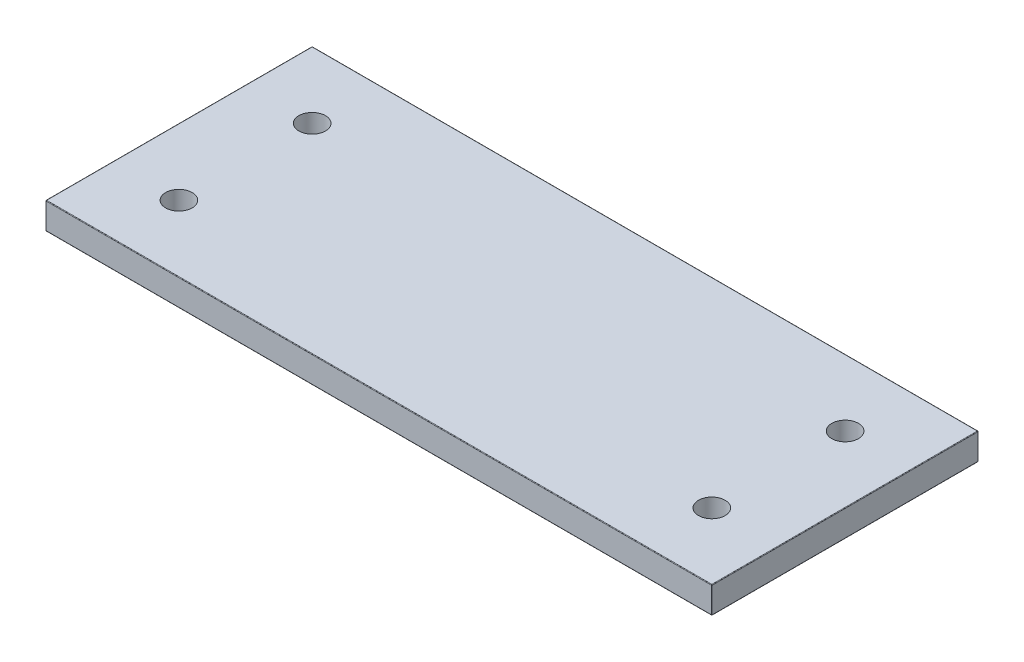
ISO-10303-21;
HEADER;
FILE_DESCRIPTION(('STEP AP214'),'2;1');
FILE_NAME('part.step','',(''),(''),'','','');
FILE_SCHEMA(('AUTOMOTIVE_DESIGN { 1 0 10303 214 1 1 1 1 }'));
ENDSEC;
DATA;
#1=APPLICATION_CONTEXT('core data for automotive mechanical design processes');
#2=APPLICATION_PROTOCOL_DEFINITION('international standard','automotive_design',2000,#1);
#3=PRODUCT_CONTEXT('',#1,'mechanical');
#4=PRODUCT('Part','Part','',(#3));
#5=PRODUCT_RELATED_PRODUCT_CATEGORY('part','',(#4));
#6=PRODUCT_DEFINITION_FORMATION('','',#4);
#7=PRODUCT_DEFINITION_CONTEXT('part definition',#1,'design');
#8=PRODUCT_DEFINITION('design','',#6,#7);
#9=PRODUCT_DEFINITION_SHAPE('','',#8);
#10=(LENGTH_UNIT() NAMED_UNIT(*) SI_UNIT(.MILLI.,.METRE.));
#11=(NAMED_UNIT(*) PLANE_ANGLE_UNIT() SI_UNIT($,.RADIAN.));
#12=(NAMED_UNIT(*) SI_UNIT($,.STERADIAN.) SOLID_ANGLE_UNIT());
#13=UNCERTAINTY_MEASURE_WITH_UNIT(LENGTH_MEASURE(1.E-05),#10,'distance_accuracy_value','');
#14=(GEOMETRIC_REPRESENTATION_CONTEXT(3) GLOBAL_UNCERTAINTY_ASSIGNED_CONTEXT((#13)) GLOBAL_UNIT_ASSIGNED_CONTEXT((#10,
#11,#12)) REPRESENTATION_CONTEXT('',''));
#15=CARTESIAN_POINT('',(0.,0.,0.));
#16=DIRECTION('',(0.,0.,1.));
#17=DIRECTION('',(1.,0.,0.));
#18=AXIS2_PLACEMENT_3D('',#15,#16,#17);
#19=CARTESIAN_POINT('',(0.,10.,0.));
#20=DIRECTION('',(0.,1.,0.));
#21=DIRECTION('',(0.,0.,1.));
#22=AXIS2_PLACEMENT_3D('',#19,#20,#21);
#23=PLANE('',#22);
#24=DIRECTION('',(-1.,0.,0.));
#25=VECTOR('',#24,1.);
#26=CARTESIAN_POINT('',(-125.,10.,-49.8));
#27=LINE('',#26,#25);
#28=CARTESIAN_POINT('',(124.8,10.,-49.8));
#29=VERTEX_POINT('',#28);
#30=CARTESIAN_POINT('',(-124.8,10.,-49.8));
#31=VERTEX_POINT('',#30);
#32=EDGE_CURVE('E201',#29,#31,#27,.T.);
#33=ORIENTED_EDGE('',*,*,#32,.T.);
#34=DIRECTION('',(0.,0.,1.));
#35=VECTOR('',#34,1.);
#36=CARTESIAN_POINT('',(-124.8,10.,50.));
#37=LINE('',#36,#35);
#38=CARTESIAN_POINT('',(-124.8,10.,49.8));
#39=VERTEX_POINT('',#38);
#40=EDGE_CURVE('E203',#31,#39,#37,.T.);
#41=ORIENTED_EDGE('',*,*,#40,.T.);
#42=DIRECTION('',(1.,0.,0.));
#43=VECTOR('',#42,1.);
#44=CARTESIAN_POINT('',(125.,10.,49.8));
#45=LINE('',#44,#43);
#46=CARTESIAN_POINT('',(124.8,10.,49.8));
#47=VERTEX_POINT('',#46);
#48=EDGE_CURVE('E197',#39,#47,#45,.T.);
#49=ORIENTED_EDGE('',*,*,#48,.T.);
#50=DIRECTION('',(0.,0.,-1.));
#51=VECTOR('',#50,1.);
#52=CARTESIAN_POINT('',(124.8,10.,-50.));
#53=LINE('',#52,#51);
#54=EDGE_CURVE('E199',#47,#29,#53,.T.);
#55=ORIENTED_EDGE('',*,*,#54,.T.);
#56=EDGE_LOOP('',(#33,#41,#49,#55));
#57=FACE_BOUND('',#56,.T.);
#58=CARTESIAN_POINT('',(-100.,10.,25.));
#59=DIRECTION('',(0.,1.,0.));
#60=DIRECTION('',(0.,0.,1.));
#61=AXIS2_PLACEMENT_3D('',#58,#59,#60);
#62=CIRCLE('',#61,5.);
#63=CARTESIAN_POINT('',(-100.,10.,30.));
#64=VERTEX_POINT('',#63);
#65=EDGE_CURVE('E275',#64,#64,#62,.T.);
#66=ORIENTED_EDGE('',*,*,#65,.F.);
#67=EDGE_LOOP('',(#66));
#68=FACE_BOUND('',#67,.T.);
#69=CARTESIAN_POINT('',(100.,10.,-25.));
#70=DIRECTION('',(0.,1.,0.));
#71=DIRECTION('',(0.,0.,1.));
#72=AXIS2_PLACEMENT_3D('',#69,#70,#71);
#73=CIRCLE('',#72,5.);
#74=CARTESIAN_POINT('',(100.,10.,-20.));
#75=VERTEX_POINT('',#74);
#76=EDGE_CURVE('E161',#75,#75,#73,.T.);
#77=ORIENTED_EDGE('',*,*,#76,.F.);
#78=EDGE_LOOP('',(#77));
#79=FACE_BOUND('',#78,.T.);
#80=CARTESIAN_POINT('',(100.,10.,25.));
#81=DIRECTION('',(0.,1.,0.));
#82=DIRECTION('',(0.,0.,-1.));
#83=AXIS2_PLACEMENT_3D('',#80,#81,#82);
#84=CIRCLE('',#83,5.);
#85=CARTESIAN_POINT('',(100.,10.,20.));
#86=VERTEX_POINT('',#85);
#87=EDGE_CURVE('E281',#86,#86,#84,.T.);
#88=ORIENTED_EDGE('',*,*,#87,.F.);
#89=EDGE_LOOP('',(#88));
#90=FACE_BOUND('',#89,.T.);
#91=CARTESIAN_POINT('',(-100.,10.,-25.));
#92=DIRECTION('',(0.,1.,0.));
#93=DIRECTION('',(0.,0.,-1.));
#94=AXIS2_PLACEMENT_3D('',#91,#92,#93);
#95=CIRCLE('',#94,5.);
#96=CARTESIAN_POINT('',(-100.,10.,-30.));
#97=VERTEX_POINT('',#96);
#98=EDGE_CURVE('E267',#97,#97,#95,.T.);
#99=ORIENTED_EDGE('',*,*,#98,.F.);
#100=EDGE_LOOP('',(#99));
#101=FACE_BOUND('',#100,.T.);
#102=ADVANCED_FACE('F35',(#57,#68,#79,#90,#101),#23,.T.);
#103=CARTESIAN_POINT('',(0.,0.,0.));
#104=DIRECTION('',(0.,1.,0.));
#105=DIRECTION('',(0.,0.,1.));
#106=AXIS2_PLACEMENT_3D('',#103,#104,#105);
#107=PLANE('',#106);
#108=DIRECTION('',(1.,0.,0.));
#109=VECTOR('',#108,1.);
#110=CARTESIAN_POINT('',(0.,0.,49.8));
#111=LINE('',#110,#109);
#112=CARTESIAN_POINT('',(124.8,0.,49.8));
#113=VERTEX_POINT('',#112);
#114=CARTESIAN_POINT('',(-124.8,0.,49.8));
#115=VERTEX_POINT('',#114);
#116=EDGE_CURVE('E188',#113,#115,#111,.F.);
#117=ORIENTED_EDGE('',*,*,#116,.T.);
#118=DIRECTION('',(0.,0.,1.));
#119=VECTOR('',#118,1.);
#120=CARTESIAN_POINT('',(-124.8,0.,0.));
#121=LINE('',#120,#119);
#122=CARTESIAN_POINT('',(-124.8,0.,-49.8));
#123=VERTEX_POINT('',#122);
#124=EDGE_CURVE('E194',#115,#123,#121,.F.);
#125=ORIENTED_EDGE('',*,*,#124,.T.);
#126=DIRECTION('',(-1.,0.,0.));
#127=VECTOR('',#126,1.);
#128=CARTESIAN_POINT('',(0.,0.,-49.8));
#129=LINE('',#128,#127);
#130=CARTESIAN_POINT('',(124.8,0.,-49.8));
#131=VERTEX_POINT('',#130);
#132=EDGE_CURVE('E192',#123,#131,#129,.F.);
#133=ORIENTED_EDGE('',*,*,#132,.T.);
#134=DIRECTION('',(0.,0.,-1.));
#135=VECTOR('',#134,1.);
#136=CARTESIAN_POINT('',(124.8,0.,0.));
#137=LINE('',#136,#135);
#138=EDGE_CURVE('E190',#131,#113,#137,.F.);
#139=ORIENTED_EDGE('',*,*,#138,.T.);
#140=EDGE_LOOP('',(#117,#125,#133,#139));
#141=FACE_BOUND('',#140,.T.);
#142=CARTESIAN_POINT('',(100.,0.,-25.));
#143=DIRECTION('',(0.,1.,0.));
#144=DIRECTION('',(0.,0.,1.));
#145=AXIS2_PLACEMENT_3D('',#142,#143,#144);
#146=CIRCLE('',#145,5.);
#147=CARTESIAN_POINT('',(100.,0.,-20.));
#148=VERTEX_POINT('',#147);
#149=EDGE_CURVE('E164',#148,#148,#146,.T.);
#150=ORIENTED_EDGE('',*,*,#149,.T.);
#151=EDGE_LOOP('',(#150));
#152=FACE_BOUND('',#151,.T.);
#153=CARTESIAN_POINT('',(100.,0.,25.));
#154=DIRECTION('',(0.,1.,0.));
#155=DIRECTION('',(0.,0.,-1.));
#156=AXIS2_PLACEMENT_3D('',#153,#154,#155);
#157=CIRCLE('',#156,5.);
#158=CARTESIAN_POINT('',(100.,0.,20.));
#159=VERTEX_POINT('',#158);
#160=EDGE_CURVE('E278',#159,#159,#157,.T.);
#161=ORIENTED_EDGE('',*,*,#160,.T.);
#162=EDGE_LOOP('',(#161));
#163=FACE_BOUND('',#162,.T.);
#164=CARTESIAN_POINT('',(-100.,0.,25.));
#165=DIRECTION('',(0.,1.,0.));
#166=DIRECTION('',(0.,0.,1.));
#167=AXIS2_PLACEMENT_3D('',#164,#165,#166);
#168=CIRCLE('',#167,5.);
#169=CARTESIAN_POINT('',(-100.,0.,30.));
#170=VERTEX_POINT('',#169);
#171=EDGE_CURVE('E272',#170,#170,#168,.T.);
#172=ORIENTED_EDGE('',*,*,#171,.T.);
#173=EDGE_LOOP('',(#172));
#174=FACE_BOUND('',#173,.T.);
#175=CARTESIAN_POINT('',(-100.,0.,-25.));
#176=DIRECTION('',(0.,1.,0.));
#177=DIRECTION('',(0.,0.,-1.));
#178=AXIS2_PLACEMENT_3D('',#175,#176,#177);
#179=CIRCLE('',#178,5.);
#180=CARTESIAN_POINT('',(-100.,0.,-30.));
#181=VERTEX_POINT('',#180);
#182=EDGE_CURVE('E262',#181,#181,#179,.T.);
#183=ORIENTED_EDGE('',*,*,#182,.T.);
#184=EDGE_LOOP('',(#183));
#185=FACE_BOUND('',#184,.T.);
#186=ADVANCED_FACE('F287',(#141,#152,#163,#174,#185),#107,.F.);
#187=CARTESIAN_POINT('',(125.,10.,-50.));
#188=DIRECTION('',(-1.,0.,0.));
#189=DIRECTION('',(0.,0.,1.));
#190=AXIS2_PLACEMENT_3D('',#187,#188,#189);
#191=PLANE('',#190);
#192=DIRECTION('',(0.,0.,-1.));
#193=VECTOR('',#192,1.);
#194=CARTESIAN_POINT('',(125.,0.200000000000001,-50.));
#195=LINE('',#194,#193);
#196=CARTESIAN_POINT('',(125.,0.200000000000001,49.8));
#197=VERTEX_POINT('',#196);
#198=CARTESIAN_POINT('',(125.,0.200000000000001,-49.8));
#199=VERTEX_POINT('',#198);
#200=EDGE_CURVE('E44',#197,#199,#195,.T.);
#201=ORIENTED_EDGE('',*,*,#200,.T.);
#202=DIRECTION('',(0.,-1.,0.));
#203=VECTOR('',#202,1.);
#204=CARTESIAN_POINT('',(125.,10.,-49.8));
#205=LINE('',#204,#203);
#206=CARTESIAN_POINT('',(125.,9.8,-49.8));
#207=VERTEX_POINT('',#206);
#208=EDGE_CURVE('E11',#199,#207,#205,.F.);
#209=ORIENTED_EDGE('',*,*,#208,.T.);
#210=DIRECTION('',(0.,0.,-1.));
#211=VECTOR('',#210,1.);
#212=CARTESIAN_POINT('',(125.,9.8,50.));
#213=LINE('',#212,#211);
#214=CARTESIAN_POINT('',(125.,9.8,49.8));
#215=VERTEX_POINT('',#214);
#216=EDGE_CURVE('E58',#207,#215,#213,.F.);
#217=ORIENTED_EDGE('',*,*,#216,.T.);
#218=DIRECTION('',(0.,-1.,0.));
#219=VECTOR('',#218,1.);
#220=CARTESIAN_POINT('',(125.,10.,49.8));
#221=LINE('',#220,#219);
#222=EDGE_CURVE('E144',#215,#197,#221,.T.);
#223=ORIENTED_EDGE('',*,*,#222,.T.);
#224=EDGE_LOOP('',(#201,#209,#217,#223));
#225=FACE_BOUND('',#224,.T.);
#226=ADVANCED_FACE('F312',(#225),#191,.F.);
#227=CARTESIAN_POINT('',(-125.,10.,-50.));
#228=DIRECTION('',(0.,0.,1.));
#229=DIRECTION('',(1.,0.,0.));
#230=AXIS2_PLACEMENT_3D('',#227,#228,#229);
#231=PLANE('',#230);
#232=DIRECTION('',(0.,-1.,0.));
#233=VECTOR('',#232,1.);
#234=CARTESIAN_POINT('',(124.8,10.,-50.));
#235=LINE('',#234,#233);
#236=CARTESIAN_POINT('',(124.8,9.8,-50.));
#237=VERTEX_POINT('',#236);
#238=CARTESIAN_POINT('',(124.8,0.200000000000001,-50.));
#239=VERTEX_POINT('',#238);
#240=EDGE_CURVE('E181',#237,#239,#235,.T.);
#241=ORIENTED_EDGE('',*,*,#240,.T.);
#242=DIRECTION('',(-1.,0.,0.));
#243=VECTOR('',#242,1.);
#244=CARTESIAN_POINT('',(-125.,0.200000000000001,-50.));
#245=LINE('',#244,#243);
#246=CARTESIAN_POINT('',(-124.8,0.200000000000001,-50.));
#247=VERTEX_POINT('',#246);
#248=EDGE_CURVE('E186',#239,#247,#245,.T.);
#249=ORIENTED_EDGE('',*,*,#248,.T.);
#250=DIRECTION('',(0.,-1.,0.));
#251=VECTOR('',#250,1.);
#252=CARTESIAN_POINT('',(-124.8,10.,-50.));
#253=LINE('',#252,#251);
#254=CARTESIAN_POINT('',(-124.8,9.8,-50.));
#255=VERTEX_POINT('',#254);
#256=EDGE_CURVE('E183',#247,#255,#253,.F.);
#257=ORIENTED_EDGE('',*,*,#256,.T.);
#258=DIRECTION('',(-1.,0.,0.));
#259=VECTOR('',#258,1.);
#260=CARTESIAN_POINT('',(125.,9.8,-50.));
#261=LINE('',#260,#259);
#262=EDGE_CURVE('E179',#255,#237,#261,.F.);
#263=ORIENTED_EDGE('',*,*,#262,.T.);
#264=EDGE_LOOP('',(#241,#249,#257,#263));
#265=FACE_BOUND('',#264,.T.);
#266=ADVANCED_FACE('F322',(#265),#231,.F.);
#267=CARTESIAN_POINT('',(-125.,10.,-50.));
#268=DIRECTION('',(1.,0.,0.));
#269=DIRECTION('',(0.,0.,-1.));
#270=AXIS2_PLACEMENT_3D('',#267,#268,#269);
#271=PLANE('',#270);
#272=DIRECTION('',(0.,-1.,0.));
#273=VECTOR('',#272,1.);
#274=CARTESIAN_POINT('',(-125.,10.,-49.8));
#275=LINE('',#274,#273);
#276=CARTESIAN_POINT('',(-125.,9.8,-49.8));
#277=VERTEX_POINT('',#276);
#278=CARTESIAN_POINT('',(-125.,0.200000000000001,-49.8));
#279=VERTEX_POINT('',#278);
#280=EDGE_CURVE('E172',#277,#279,#275,.T.);
#281=ORIENTED_EDGE('',*,*,#280,.T.);
#282=DIRECTION('',(0.,0.,1.));
#283=VECTOR('',#282,1.);
#284=CARTESIAN_POINT('',(-125.,0.200000000000001,-50.));
#285=LINE('',#284,#283);
#286=CARTESIAN_POINT('',(-125.,0.200000000000001,49.8));
#287=VERTEX_POINT('',#286);
#288=EDGE_CURVE('E177',#279,#287,#285,.T.);
#289=ORIENTED_EDGE('',*,*,#288,.T.);
#290=DIRECTION('',(0.,-1.,0.));
#291=VECTOR('',#290,1.);
#292=CARTESIAN_POINT('',(-125.,10.,49.8));
#293=LINE('',#292,#291);
#294=CARTESIAN_POINT('',(-125.,9.8,49.8));
#295=VERTEX_POINT('',#294);
#296=EDGE_CURVE('E174',#287,#295,#293,.F.);
#297=ORIENTED_EDGE('',*,*,#296,.T.);
#298=DIRECTION('',(0.,0.,1.));
#299=VECTOR('',#298,1.);
#300=CARTESIAN_POINT('',(-125.,9.8,-50.));
#301=LINE('',#300,#299);
#302=EDGE_CURVE('E170',#295,#277,#301,.F.);
#303=ORIENTED_EDGE('',*,*,#302,.T.);
#304=EDGE_LOOP('',(#281,#289,#297,#303));
#305=FACE_BOUND('',#304,.T.);
#306=ADVANCED_FACE('F319',(#305),#271,.F.);
#307=CARTESIAN_POINT('',(-125.,10.,50.));
#308=DIRECTION('',(0.,0.,-1.));
#309=DIRECTION('',(-1.,0.,0.));
#310=AXIS2_PLACEMENT_3D('',#307,#308,#309);
#311=PLANE('',#310);
#312=DIRECTION('',(0.,-1.,0.));
#313=VECTOR('',#312,1.);
#314=CARTESIAN_POINT('',(-124.8,10.,50.));
#315=LINE('',#314,#313);
#316=CARTESIAN_POINT('',(-124.8,9.8,50.));
#317=VERTEX_POINT('',#316);
#318=CARTESIAN_POINT('',(-124.8,0.200000000000001,50.));
#319=VERTEX_POINT('',#318);
#320=EDGE_CURVE('E137',#317,#319,#315,.T.);
#321=ORIENTED_EDGE('',*,*,#320,.T.);
#322=DIRECTION('',(1.,0.,0.));
#323=VECTOR('',#322,1.);
#324=CARTESIAN_POINT('',(-125.,0.200000000000001,50.));
#325=LINE('',#324,#323);
#326=CARTESIAN_POINT('',(124.8,0.200000000000001,50.));
#327=VERTEX_POINT('',#326);
#328=EDGE_CURVE('E133',#319,#327,#325,.T.);
#329=ORIENTED_EDGE('',*,*,#328,.T.);
#330=DIRECTION('',(0.,-1.,0.));
#331=VECTOR('',#330,1.);
#332=CARTESIAN_POINT('',(124.8,10.,50.));
#333=LINE('',#332,#331);
#334=CARTESIAN_POINT('',(124.8,9.8,50.));
#335=VERTEX_POINT('',#334);
#336=EDGE_CURVE('E125',#327,#335,#333,.F.);
#337=ORIENTED_EDGE('',*,*,#336,.T.);
#338=DIRECTION('',(1.,0.,0.));
#339=VECTOR('',#338,1.);
#340=CARTESIAN_POINT('',(-125.,9.8,50.));
#341=LINE('',#340,#339);
#342=EDGE_CURVE('E130',#335,#317,#341,.F.);
#343=ORIENTED_EDGE('',*,*,#342,.T.);
#344=EDGE_LOOP('',(#321,#329,#337,#343));
#345=FACE_BOUND('',#344,.T.);
#346=ADVANCED_FACE('F128',(#345),#311,.F.);
#347=CARTESIAN_POINT('',(100.,10.,-25.));
#348=DIRECTION('',(0.,-1.,0.));
#349=DIRECTION('',(0.,0.,-1.));
#350=AXIS2_PLACEMENT_3D('',#347,#348,#349);
#351=CYLINDRICAL_SURFACE('',#350,5.);
#352=ORIENTED_EDGE('',*,*,#76,.T.);
#353=EDGE_LOOP('',(#352));
#354=FACE_BOUND('',#353,.T.);
#355=ORIENTED_EDGE('',*,*,#149,.F.);
#356=EDGE_LOOP('',(#355));
#357=FACE_BOUND('',#356,.T.);
#358=ADVANCED_FACE('F293',(#354,#357),#351,.F.);
#359=CARTESIAN_POINT('',(100.,10.,25.));
#360=DIRECTION('',(0.,-1.,0.));
#361=DIRECTION('',(0.,0.,-1.));
#362=AXIS2_PLACEMENT_3D('',#359,#360,#361);
#363=CYLINDRICAL_SURFACE('',#362,5.);
#364=ORIENTED_EDGE('',*,*,#87,.T.);
#365=EDGE_LOOP('',(#364));
#366=FACE_BOUND('',#365,.T.);
#367=ORIENTED_EDGE('',*,*,#160,.F.);
#368=EDGE_LOOP('',(#367));
#369=FACE_BOUND('',#368,.T.);
#370=ADVANCED_FACE('F290',(#366,#369),#363,.F.);
#371=CARTESIAN_POINT('',(-100.,10.,25.));
#372=DIRECTION('',(0.,-1.,0.));
#373=DIRECTION('',(0.,0.,-1.));
#374=AXIS2_PLACEMENT_3D('',#371,#372,#373);
#375=CYLINDRICAL_SURFACE('',#374,5.);
#376=ORIENTED_EDGE('',*,*,#65,.T.);
#377=EDGE_LOOP('',(#376));
#378=FACE_BOUND('',#377,.T.);
#379=ORIENTED_EDGE('',*,*,#171,.F.);
#380=EDGE_LOOP('',(#379));
#381=FACE_BOUND('',#380,.T.);
#382=ADVANCED_FACE('F292',(#378,#381),#375,.F.);
#383=CARTESIAN_POINT('',(-100.,10.,-25.));
#384=DIRECTION('',(0.,-1.,0.));
#385=DIRECTION('',(0.,0.,-1.));
#386=AXIS2_PLACEMENT_3D('',#383,#384,#385);
#387=CYLINDRICAL_SURFACE('',#386,5.);
#388=ORIENTED_EDGE('',*,*,#98,.T.);
#389=EDGE_LOOP('',(#388));
#390=FACE_BOUND('',#389,.T.);
#391=ORIENTED_EDGE('',*,*,#182,.F.);
#392=EDGE_LOOP('',(#391));
#393=FACE_BOUND('',#392,.T.);
#394=ADVANCED_FACE('F300',(#390,#393),#387,.F.);
#395=CARTESIAN_POINT('',(124.8,10.,-49.8));
#396=DIRECTION('',(0.,-1.,0.));
#397=DIRECTION('',(0.,0.,-1.));
#398=AXIS2_PLACEMENT_3D('',#395,#396,#397);
#399=CYLINDRICAL_SURFACE('',#398,0.2);
#400=CARTESIAN_POINT('',(124.8,9.8,-49.8));
#401=DIRECTION('',(0.,1.,0.));
#402=DIRECTION('',(0.,0.,1.));
#403=AXIS2_PLACEMENT_3D('',#400,#401,#402);
#404=CIRCLE('',#403,0.2);
#405=EDGE_CURVE('E39',#207,#237,#404,.T.);
#406=ORIENTED_EDGE('',*,*,#405,.F.);
#407=ORIENTED_EDGE('',*,*,#208,.F.);
#408=CARTESIAN_POINT('',(124.8,0.200000000000001,-49.8));
#409=DIRECTION('',(0.,-1.,0.));
#410=DIRECTION('',(0.,0.,-1.));
#411=AXIS2_PLACEMENT_3D('',#408,#409,#410);
#412=CIRCLE('',#411,0.2);
#413=EDGE_CURVE('E255',#239,#199,#412,.T.);
#414=ORIENTED_EDGE('',*,*,#413,.F.);
#415=ORIENTED_EDGE('',*,*,#240,.F.);
#416=EDGE_LOOP('',(#406,#407,#414,#415));
#417=FACE_BOUND('',#416,.T.);
#418=ADVANCED_FACE('F37',(#417),#399,.T.);
#419=CARTESIAN_POINT('',(124.8,9.8,-49.8));
#420=DIRECTION('',(0.,0.,1.));
#421=DIRECTION('',(1.,0.,0.));
#422=AXIS2_PLACEMENT_3D('',#419,#420,#421);
#423=SPHERICAL_SURFACE('',#422,0.2);
#424=CARTESIAN_POINT('',(124.8,9.8,-49.8));
#425=DIRECTION('',(0.,0.,-1.));
#426=DIRECTION('',(-1.,0.,0.));
#427=AXIS2_PLACEMENT_3D('',#424,#425,#426);
#428=CIRCLE('',#427,0.2);
#429=EDGE_CURVE('E251',#207,#29,#428,.F.);
#430=ORIENTED_EDGE('',*,*,#429,.F.);
#431=ORIENTED_EDGE('',*,*,#405,.T.);
#432=CARTESIAN_POINT('',(124.8,9.8,-49.8));
#433=DIRECTION('',(1.,0.,0.));
#434=DIRECTION('',(0.,1.,0.));
#435=AXIS2_PLACEMENT_3D('',#432,#433,#434);
#436=CIRCLE('',#435,0.2);
#437=EDGE_CURVE('E253',#29,#237,#436,.F.);
#438=ORIENTED_EDGE('',*,*,#437,.F.);
#439=EDGE_LOOP('',(#430,#431,#438));
#440=FACE_BOUND('',#439,.T.);
#441=ADVANCED_FACE('F392',(#440),#423,.T.);
#442=CARTESIAN_POINT('',(124.8,0.2,-49.8));
#443=DIRECTION('',(0.,0.,1.));
#444=DIRECTION('',(1.,0.,0.));
#445=AXIS2_PLACEMENT_3D('',#442,#443,#444);
#446=SPHERICAL_SURFACE('',#445,0.2);
#447=CARTESIAN_POINT('',(124.8,0.2,-49.8));
#448=DIRECTION('',(1.,0.,0.));
#449=DIRECTION('',(0.,0.,-1.));
#450=AXIS2_PLACEMENT_3D('',#447,#448,#449);
#451=CIRCLE('',#450,0.2);
#452=EDGE_CURVE('E245',#239,#131,#451,.F.);
#453=ORIENTED_EDGE('',*,*,#452,.F.);
#454=ORIENTED_EDGE('',*,*,#413,.T.);
#455=CARTESIAN_POINT('',(124.8,0.200000000000001,-49.8));
#456=DIRECTION('',(0.,0.,-1.));
#457=DIRECTION('',(-1.,0.,0.));
#458=AXIS2_PLACEMENT_3D('',#455,#456,#457);
#459=CIRCLE('',#458,0.2);
#460=EDGE_CURVE('E248',#131,#199,#459,.F.);
#461=ORIENTED_EDGE('',*,*,#460,.F.);
#462=EDGE_LOOP('',(#453,#454,#461));
#463=FACE_BOUND('',#462,.T.);
#464=ADVANCED_FACE('F389',(#463),#446,.T.);
#465=CARTESIAN_POINT('',(0.,9.8,-49.8));
#466=DIRECTION('',(1.,0.,0.));
#467=DIRECTION('',(0.,0.,-1.));
#468=AXIS2_PLACEMENT_3D('',#465,#466,#467);
#469=CYLINDRICAL_SURFACE('',#468,0.2);
#470=ORIENTED_EDGE('',*,*,#437,.T.);
#471=ORIENTED_EDGE('',*,*,#262,.F.);
#472=CARTESIAN_POINT('',(-124.8,9.8,-49.8));
#473=DIRECTION('',(-1.,0.,0.));
#474=DIRECTION('',(0.,0.,1.));
#475=AXIS2_PLACEMENT_3D('',#472,#473,#474);
#476=CIRCLE('',#475,0.2);
#477=EDGE_CURVE('E240',#31,#255,#476,.T.);
#478=ORIENTED_EDGE('',*,*,#477,.F.);
#479=ORIENTED_EDGE('',*,*,#32,.F.);
#480=EDGE_LOOP('',(#470,#471,#478,#479));
#481=FACE_BOUND('',#480,.T.);
#482=ADVANCED_FACE('F386',(#481),#469,.T.);
#483=CARTESIAN_POINT('',(124.8,9.8,0.));
#484=DIRECTION('',(0.,0.,1.));
#485=DIRECTION('',(1.,0.,0.));
#486=AXIS2_PLACEMENT_3D('',#483,#484,#485);
#487=CYLINDRICAL_SURFACE('',#486,0.2);
#488=ORIENTED_EDGE('',*,*,#429,.T.);
#489=ORIENTED_EDGE('',*,*,#54,.F.);
#490=CARTESIAN_POINT('',(124.8,9.8,49.8));
#491=DIRECTION('',(0.,0.,1.));
#492=DIRECTION('',(0.,-1.,0.));
#493=AXIS2_PLACEMENT_3D('',#490,#491,#492);
#494=CIRCLE('',#493,0.2);
#495=EDGE_CURVE('E147',#215,#47,#494,.T.);
#496=ORIENTED_EDGE('',*,*,#495,.F.);
#497=ORIENTED_EDGE('',*,*,#216,.F.);
#498=EDGE_LOOP('',(#488,#489,#496,#497));
#499=FACE_BOUND('',#498,.T.);
#500=ADVANCED_FACE('F383',(#499),#487,.T.);
#501=CARTESIAN_POINT('',(124.8,10.,49.8));
#502=DIRECTION('',(0.,-1.,0.));
#503=DIRECTION('',(0.,0.,-1.));
#504=AXIS2_PLACEMENT_3D('',#501,#502,#503);
#505=CYLINDRICAL_SURFACE('',#504,0.2);
#506=CARTESIAN_POINT('',(124.8,0.200000000000001,49.8));
#507=DIRECTION('',(0.,-1.,0.));
#508=DIRECTION('',(0.,0.,-1.));
#509=AXIS2_PLACEMENT_3D('',#506,#507,#508);
#510=CIRCLE('',#509,0.2);
#511=EDGE_CURVE('E148',#197,#327,#510,.T.);
#512=ORIENTED_EDGE('',*,*,#511,.F.);
#513=ORIENTED_EDGE('',*,*,#222,.F.);
#514=CARTESIAN_POINT('',(124.8,9.8,49.8));
#515=DIRECTION('',(0.,1.,0.));
#516=DIRECTION('',(0.,0.,1.));
#517=AXIS2_PLACEMENT_3D('',#514,#515,#516);
#518=CIRCLE('',#517,0.2);
#519=EDGE_CURVE('E141',#335,#215,#518,.T.);
#520=ORIENTED_EDGE('',*,*,#519,.F.);
#521=ORIENTED_EDGE('',*,*,#336,.F.);
#522=EDGE_LOOP('',(#512,#513,#520,#521));
#523=FACE_BOUND('',#522,.T.);
#524=ADVANCED_FACE('F143',(#523),#505,.T.);
#525=CARTESIAN_POINT('',(124.8,0.200000000000001,-50.));
#526=DIRECTION('',(0.,0.,-1.));
#527=DIRECTION('',(-1.,0.,0.));
#528=AXIS2_PLACEMENT_3D('',#525,#526,#527);
#529=CYLINDRICAL_SURFACE('',#528,0.2);
#530=ORIENTED_EDGE('',*,*,#460,.T.);
#531=ORIENTED_EDGE('',*,*,#200,.F.);
#532=CARTESIAN_POINT('',(124.8,0.2,49.8));
#533=DIRECTION('',(0.,0.,1.));
#534=DIRECTION('',(1.,0.,0.));
#535=AXIS2_PLACEMENT_3D('',#532,#533,#534);
#536=CIRCLE('',#535,0.2);
#537=EDGE_CURVE('E235',#113,#197,#536,.T.);
#538=ORIENTED_EDGE('',*,*,#537,.F.);
#539=ORIENTED_EDGE('',*,*,#138,.F.);
#540=EDGE_LOOP('',(#530,#531,#538,#539));
#541=FACE_BOUND('',#540,.T.);
#542=ADVANCED_FACE('F376',(#541),#529,.T.);
#543=CARTESIAN_POINT('',(-125.,0.200000000000001,-49.8));
#544=DIRECTION('',(-1.,0.,0.));
#545=DIRECTION('',(0.,0.,1.));
#546=AXIS2_PLACEMENT_3D('',#543,#544,#545);
#547=CYLINDRICAL_SURFACE('',#546,0.2);
#548=ORIENTED_EDGE('',*,*,#452,.T.);
#549=ORIENTED_EDGE('',*,*,#132,.F.);
#550=CARTESIAN_POINT('',(-124.8,0.200000000000001,-49.8));
#551=DIRECTION('',(-1.,0.,0.));
#552=DIRECTION('',(0.,0.,1.));
#553=AXIS2_PLACEMENT_3D('',#550,#551,#552);
#554=CIRCLE('',#553,0.2);
#555=EDGE_CURVE('E232',#247,#123,#554,.T.);
#556=ORIENTED_EDGE('',*,*,#555,.F.);
#557=ORIENTED_EDGE('',*,*,#248,.F.);
#558=EDGE_LOOP('',(#548,#549,#556,#557));
#559=FACE_BOUND('',#558,.T.);
#560=ADVANCED_FACE('F372',(#559),#547,.T.);
#561=CARTESIAN_POINT('',(-124.8,10.,-49.8));
#562=DIRECTION('',(0.,-1.,0.));
#563=DIRECTION('',(0.,0.,-1.));
#564=AXIS2_PLACEMENT_3D('',#561,#562,#563);
#565=CYLINDRICAL_SURFACE('',#564,0.2);
#566=CARTESIAN_POINT('',(-124.8,9.8,-49.8));
#567=DIRECTION('',(0.,1.,0.));
#568=DIRECTION('',(0.,0.,1.));
#569=AXIS2_PLACEMENT_3D('',#566,#567,#568);
#570=CIRCLE('',#569,0.2);
#571=EDGE_CURVE('E242',#255,#277,#570,.T.);
#572=ORIENTED_EDGE('',*,*,#571,.F.);
#573=ORIENTED_EDGE('',*,*,#256,.F.);
#574=CARTESIAN_POINT('',(-124.8,0.200000000000001,-49.8));
#575=DIRECTION('',(0.,-1.,0.));
#576=DIRECTION('',(0.,0.,-1.));
#577=AXIS2_PLACEMENT_3D('',#574,#575,#576);
#578=CIRCLE('',#577,0.2);
#579=EDGE_CURVE('E229',#279,#247,#578,.T.);
#580=ORIENTED_EDGE('',*,*,#579,.F.);
#581=ORIENTED_EDGE('',*,*,#280,.F.);
#582=EDGE_LOOP('',(#572,#573,#580,#581));
#583=FACE_BOUND('',#582,.T.);
#584=ADVANCED_FACE('F368',(#583),#565,.T.);
#585=CARTESIAN_POINT('',(-124.8,9.8,-49.8));
#586=DIRECTION('',(0.,0.,1.));
#587=DIRECTION('',(1.,0.,0.));
#588=AXIS2_PLACEMENT_3D('',#585,#586,#587);
#589=SPHERICAL_SURFACE('',#588,0.2);
#590=ORIENTED_EDGE('',*,*,#477,.T.);
#591=ORIENTED_EDGE('',*,*,#571,.T.);
#592=CARTESIAN_POINT('',(-124.8,9.8,-49.8));
#593=DIRECTION('',(0.,0.,-1.));
#594=DIRECTION('',(-1.,0.,0.));
#595=AXIS2_PLACEMENT_3D('',#592,#593,#594);
#596=CIRCLE('',#595,0.2);
#597=EDGE_CURVE('E155',#31,#277,#596,.F.);
#598=ORIENTED_EDGE('',*,*,#597,.F.);
#599=EDGE_LOOP('',(#590,#591,#598));
#600=FACE_BOUND('',#599,.T.);
#601=ADVANCED_FACE('F365',(#600),#589,.T.);
#602=CARTESIAN_POINT('',(124.8,9.8,49.8));
#603=DIRECTION('',(0.,0.,1.));
#604=DIRECTION('',(1.,0.,0.));
#605=AXIS2_PLACEMENT_3D('',#602,#603,#604);
#606=SPHERICAL_SURFACE('',#605,0.2);
#607=ORIENTED_EDGE('',*,*,#519,.T.);
#608=ORIENTED_EDGE('',*,*,#495,.T.);
#609=CARTESIAN_POINT('',(124.8,9.8,49.8));
#610=DIRECTION('',(1.,0.,0.));
#611=DIRECTION('',(0.,0.,-1.));
#612=AXIS2_PLACEMENT_3D('',#609,#610,#611);
#613=CIRCLE('',#612,0.2);
#614=EDGE_CURVE('E151',#335,#47,#613,.F.);
#615=ORIENTED_EDGE('',*,*,#614,.F.);
#616=EDGE_LOOP('',(#607,#608,#615));
#617=FACE_BOUND('',#616,.T.);
#618=ADVANCED_FACE('F152',(#617),#606,.T.);
#619=CARTESIAN_POINT('',(124.8,0.2,49.8));
#620=DIRECTION('',(0.,0.,1.));
#621=DIRECTION('',(1.,0.,0.));
#622=AXIS2_PLACEMENT_3D('',#619,#620,#621);
#623=SPHERICAL_SURFACE('',#622,0.2);
#624=ORIENTED_EDGE('',*,*,#537,.T.);
#625=ORIENTED_EDGE('',*,*,#511,.T.);
#626=CARTESIAN_POINT('',(124.8,0.200000000000001,49.8));
#627=DIRECTION('',(1.,0.,0.));
#628=DIRECTION('',(0.,0.,-1.));
#629=AXIS2_PLACEMENT_3D('',#626,#627,#628);
#630=CIRCLE('',#629,0.2);
#631=EDGE_CURVE('E156',#113,#327,#630,.F.);
#632=ORIENTED_EDGE('',*,*,#631,.F.);
#633=EDGE_LOOP('',(#624,#625,#632));
#634=FACE_BOUND('',#633,.T.);
#635=ADVANCED_FACE('F358',(#634),#623,.T.);
#636=CARTESIAN_POINT('',(-124.8,0.2,-49.8));
#637=DIRECTION('',(0.,0.,1.));
#638=DIRECTION('',(1.,0.,0.));
#639=AXIS2_PLACEMENT_3D('',#636,#637,#638);
#640=SPHERICAL_SURFACE('',#639,0.2);
#641=ORIENTED_EDGE('',*,*,#579,.T.);
#642=ORIENTED_EDGE('',*,*,#555,.T.);
#643=CARTESIAN_POINT('',(-124.8,0.2,-49.8));
#644=DIRECTION('',(0.,0.,-1.));
#645=DIRECTION('',(-1.,0.,0.));
#646=AXIS2_PLACEMENT_3D('',#643,#644,#645);
#647=CIRCLE('',#646,0.2);
#648=EDGE_CURVE('E223',#279,#123,#647,.F.);
#649=ORIENTED_EDGE('',*,*,#648,.F.);
#650=EDGE_LOOP('',(#641,#642,#649));
#651=FACE_BOUND('',#650,.T.);
#652=ADVANCED_FACE('F354',(#651),#640,.T.);
#653=CARTESIAN_POINT('',(-124.8,9.8,0.));
#654=DIRECTION('',(0.,0.,-1.));
#655=DIRECTION('',(-1.,0.,0.));
#656=AXIS2_PLACEMENT_3D('',#653,#654,#655);
#657=CYLINDRICAL_SURFACE('',#656,0.2);
#658=ORIENTED_EDGE('',*,*,#597,.T.);
#659=ORIENTED_EDGE('',*,*,#302,.F.);
#660=CARTESIAN_POINT('',(-124.8,9.8,49.8));
#661=DIRECTION('',(0.,0.,1.));
#662=DIRECTION('',(1.,0.,0.));
#663=AXIS2_PLACEMENT_3D('',#660,#661,#662);
#664=CIRCLE('',#663,0.2);
#665=EDGE_CURVE('E220',#39,#295,#664,.T.);
#666=ORIENTED_EDGE('',*,*,#665,.F.);
#667=ORIENTED_EDGE('',*,*,#40,.F.);
#668=EDGE_LOOP('',(#658,#659,#666,#667));
#669=FACE_BOUND('',#668,.T.);
#670=ADVANCED_FACE('F351',(#669),#657,.T.);
#671=CARTESIAN_POINT('',(0.,9.8,49.8));
#672=DIRECTION('',(-1.,0.,0.));
#673=DIRECTION('',(0.,0.,1.));
#674=AXIS2_PLACEMENT_3D('',#671,#672,#673);
#675=CYLINDRICAL_SURFACE('',#674,0.2);
#676=ORIENTED_EDGE('',*,*,#614,.T.);
#677=ORIENTED_EDGE('',*,*,#48,.F.);
#678=CARTESIAN_POINT('',(-124.8,9.8,49.8));
#679=DIRECTION('',(-1.,0.,0.));
#680=DIRECTION('',(0.,0.,1.));
#681=AXIS2_PLACEMENT_3D('',#678,#679,#680);
#682=CIRCLE('',#681,0.2);
#683=EDGE_CURVE('E159',#317,#39,#682,.T.);
#684=ORIENTED_EDGE('',*,*,#683,.F.);
#685=ORIENTED_EDGE('',*,*,#342,.F.);
#686=EDGE_LOOP('',(#676,#677,#684,#685));
#687=FACE_BOUND('',#686,.T.);
#688=ADVANCED_FACE('F158',(#687),#675,.T.);
#689=CARTESIAN_POINT('',(-125.,0.200000000000001,49.8));
#690=DIRECTION('',(1.,0.,0.));
#691=DIRECTION('',(0.,0.,-1.));
#692=AXIS2_PLACEMENT_3D('',#689,#690,#691);
#693=CYLINDRICAL_SURFACE('',#692,0.2);
#694=ORIENTED_EDGE('',*,*,#631,.T.);
#695=ORIENTED_EDGE('',*,*,#328,.F.);
#696=CARTESIAN_POINT('',(-124.8,0.2,49.8));
#697=DIRECTION('',(-1.,0.,0.));
#698=DIRECTION('',(0.,0.,1.));
#699=AXIS2_PLACEMENT_3D('',#696,#697,#698);
#700=CIRCLE('',#699,0.2);
#701=EDGE_CURVE('E216',#115,#319,#700,.T.);
#702=ORIENTED_EDGE('',*,*,#701,.F.);
#703=ORIENTED_EDGE('',*,*,#116,.F.);
#704=EDGE_LOOP('',(#694,#695,#702,#703));
#705=FACE_BOUND('',#704,.T.);
#706=ADVANCED_FACE('F344',(#705),#693,.T.);
#707=CARTESIAN_POINT('',(-124.8,0.200000000000001,-50.));
#708=DIRECTION('',(0.,0.,1.));
#709=DIRECTION('',(1.,0.,0.));
#710=AXIS2_PLACEMENT_3D('',#707,#708,#709);
#711=CYLINDRICAL_SURFACE('',#710,0.2);
#712=ORIENTED_EDGE('',*,*,#648,.T.);
#713=ORIENTED_EDGE('',*,*,#124,.F.);
#714=CARTESIAN_POINT('',(-124.8,0.200000000000001,49.8));
#715=DIRECTION('',(0.,0.,1.));
#716=DIRECTION('',(1.,0.,0.));
#717=AXIS2_PLACEMENT_3D('',#714,#715,#716);
#718=CIRCLE('',#717,0.2);
#719=EDGE_CURVE('E213',#287,#115,#718,.T.);
#720=ORIENTED_EDGE('',*,*,#719,.F.);
#721=ORIENTED_EDGE('',*,*,#288,.F.);
#722=EDGE_LOOP('',(#712,#713,#720,#721));
#723=FACE_BOUND('',#722,.T.);
#724=ADVANCED_FACE('F340',(#723),#711,.T.);
#725=CARTESIAN_POINT('',(-124.8,9.8,49.8));
#726=DIRECTION('',(0.,0.,1.));
#727=DIRECTION('',(1.,0.,0.));
#728=AXIS2_PLACEMENT_3D('',#725,#726,#727);
#729=SPHERICAL_SURFACE('',#728,0.2);
#730=ORIENTED_EDGE('',*,*,#683,.T.);
#731=ORIENTED_EDGE('',*,*,#665,.T.);
#732=CARTESIAN_POINT('',(-124.8,9.8,49.8));
#733=DIRECTION('',(0.,1.,0.));
#734=DIRECTION('',(0.,0.,1.));
#735=AXIS2_PLACEMENT_3D('',#732,#733,#734);
#736=CIRCLE('',#735,0.2);
#737=EDGE_CURVE('E211',#317,#295,#736,.F.);
#738=ORIENTED_EDGE('',*,*,#737,.F.);
#739=EDGE_LOOP('',(#730,#731,#738));
#740=FACE_BOUND('',#739,.T.);
#741=ADVANCED_FACE('F336',(#740),#729,.T.);
#742=CARTESIAN_POINT('',(-124.8,0.2,49.8));
#743=DIRECTION('',(0.,0.,1.));
#744=DIRECTION('',(1.,0.,0.));
#745=AXIS2_PLACEMENT_3D('',#742,#743,#744);
#746=SPHERICAL_SURFACE('',#745,0.2);
#747=ORIENTED_EDGE('',*,*,#719,.T.);
#748=ORIENTED_EDGE('',*,*,#701,.T.);
#749=CARTESIAN_POINT('',(-124.8,0.200000000000001,49.8));
#750=DIRECTION('',(0.,-1.,0.));
#751=DIRECTION('',(0.,0.,-1.));
#752=AXIS2_PLACEMENT_3D('',#749,#750,#751);
#753=CIRCLE('',#752,0.2);
#754=EDGE_CURVE('E209',#287,#319,#753,.F.);
#755=ORIENTED_EDGE('',*,*,#754,.F.);
#756=EDGE_LOOP('',(#747,#748,#755));
#757=FACE_BOUND('',#756,.T.);
#758=ADVANCED_FACE('F332',(#757),#746,.T.);
#759=CARTESIAN_POINT('',(-124.8,10.,49.8));
#760=DIRECTION('',(0.,-1.,0.));
#761=DIRECTION('',(0.,0.,-1.));
#762=AXIS2_PLACEMENT_3D('',#759,#760,#761);
#763=CYLINDRICAL_SURFACE('',#762,0.2);
#764=ORIENTED_EDGE('',*,*,#737,.T.);
#765=ORIENTED_EDGE('',*,*,#296,.F.);
#766=ORIENTED_EDGE('',*,*,#754,.T.);
#767=ORIENTED_EDGE('',*,*,#320,.F.);
#768=EDGE_LOOP('',(#764,#765,#766,#767));
#769=FACE_BOUND('',#768,.T.);
#770=ADVANCED_FACE('F329',(#769),#763,.T.);
#771=CLOSED_SHELL('',(#102,#186,#226,#266,#306,#346,#358,#370,#382,#394,#418,#441,#464,#482,
#500,#524,#542,#560,#584,#601,#618,#635,#652,#670,#688,#706,#724,#741,#758,#770));
#772=MANIFOLD_SOLID_BREP('B2',#771);
#773=ADVANCED_BREP_SHAPE_REPRESENTATION('',(#18,#772),#14);
#774=SHAPE_DEFINITION_REPRESENTATION(#9,#773);
ENDSEC;
END-ISO-10303-21;
